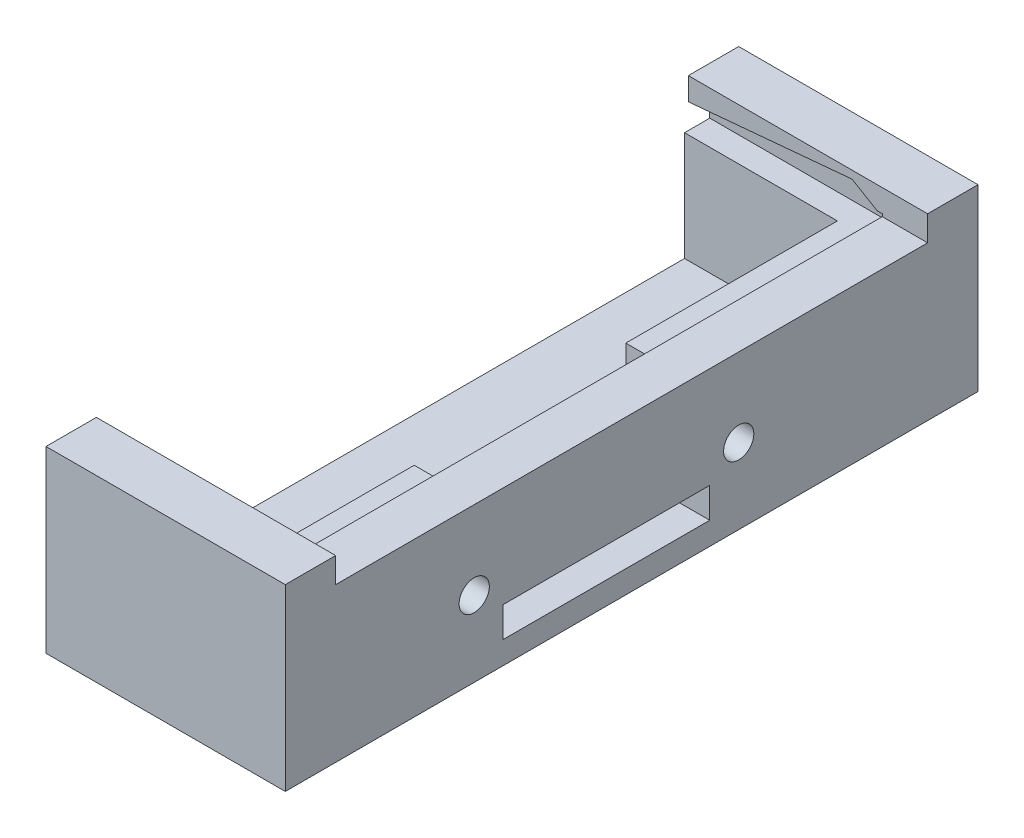
ISO-10303-21;
HEADER;
FILE_DESCRIPTION(('STEP AP214'),'2;1');
FILE_NAME('part.step','',(''),(''),'','','');
FILE_SCHEMA(('AUTOMOTIVE_DESIGN { 1 0 10303 214 1 1 1 1 }'));
ENDSEC;
DATA;
#1=APPLICATION_CONTEXT('core data for automotive mechanical design processes');
#2=APPLICATION_PROTOCOL_DEFINITION('international standard','automotive_design',2000,#1);
#3=PRODUCT_CONTEXT('',#1,'mechanical');
#4=PRODUCT('Part','Part','',(#3));
#5=PRODUCT_RELATED_PRODUCT_CATEGORY('part','',(#4));
#6=PRODUCT_DEFINITION_FORMATION('','',#4);
#7=PRODUCT_DEFINITION_CONTEXT('part definition',#1,'design');
#8=PRODUCT_DEFINITION('design','',#6,#7);
#9=PRODUCT_DEFINITION_SHAPE('','',#8);
#10=(LENGTH_UNIT() NAMED_UNIT(*) SI_UNIT(.MILLI.,.METRE.));
#11=(NAMED_UNIT(*) PLANE_ANGLE_UNIT() SI_UNIT($,.RADIAN.));
#12=(NAMED_UNIT(*) SI_UNIT($,.STERADIAN.) SOLID_ANGLE_UNIT());
#13=UNCERTAINTY_MEASURE_WITH_UNIT(LENGTH_MEASURE(1.E-05),#10,'distance_accuracy_value','');
#14=(GEOMETRIC_REPRESENTATION_CONTEXT(3) GLOBAL_UNCERTAINTY_ASSIGNED_CONTEXT((#13)) GLOBAL_UNIT_ASSIGNED_CONTEXT((#10,
#11,#12)) REPRESENTATION_CONTEXT('',''));
#15=CARTESIAN_POINT('',(0.,0.,0.));
#16=DIRECTION('',(0.,0.,1.));
#17=DIRECTION('',(1.,0.,0.));
#18=AXIS2_PLACEMENT_3D('',#15,#16,#17);
#19=CARTESIAN_POINT('',(5.08,4.54,3.175));
#20=DIRECTION('',(0.,-1.,0.));
#21=DIRECTION('',(0.,0.,-1.));
#22=AXIS2_PLACEMENT_3D('',#19,#20,#21);
#23=PLANE('',#22);
#24=DIRECTION('',(0.,0.,1.));
#25=VECTOR('',#24,1.);
#26=CARTESIAN_POINT('',(5.08,4.54,3.175));
#27=LINE('',#26,#25);
#28=CARTESIAN_POINT('',(5.08000000000001,4.54,-1.905));
#29=VERTEX_POINT('',#28);
#30=CARTESIAN_POINT('',(5.08,4.54,3.175));
#31=VERTEX_POINT('',#30);
#32=EDGE_CURVE('E440',#29,#31,#27,.T.);
#33=ORIENTED_EDGE('',*,*,#32,.F.);
#34=DIRECTION('',(1.,0.,0.));
#35=VECTOR('',#34,1.);
#36=CARTESIAN_POINT('',(5.08000000000001,4.54,-1.905));
#37=LINE('',#36,#35);
#38=CARTESIAN_POINT('',(-19.05,4.54,-1.905));
#39=VERTEX_POINT('',#38);
#40=EDGE_CURVE('E360',#39,#29,#37,.T.);
#41=ORIENTED_EDGE('',*,*,#40,.F.);
#42=DIRECTION('',(0.,0.,1.));
#43=VECTOR('',#42,1.);
#44=CARTESIAN_POINT('',(-19.05,4.54,3.175));
#45=LINE('',#44,#43);
#46=CARTESIAN_POINT('',(-19.05,4.54,3.175));
#47=VERTEX_POINT('',#46);
#48=EDGE_CURVE('E429',#39,#47,#45,.T.);
#49=ORIENTED_EDGE('',*,*,#48,.T.);
#50=DIRECTION('',(-1.,0.,0.));
#51=VECTOR('',#50,1.);
#52=CARTESIAN_POINT('',(5.08,4.54,3.175));
#53=LINE('',#52,#51);
#54=EDGE_CURVE('E444',#31,#47,#53,.T.);
#55=ORIENTED_EDGE('',*,*,#54,.F.);
#56=EDGE_LOOP('',(#33,#41,#49,#55));
#57=FACE_BOUND('',#56,.T.);
#58=ADVANCED_FACE('F40',(#57),#23,.F.);
#59=CARTESIAN_POINT('',(0.,2.254,0.));
#60=DIRECTION('',(0.,1.,0.));
#61=DIRECTION('',(0.,0.,1.));
#62=AXIS2_PLACEMENT_3D('',#59,#60,#61);
#63=PLANE('',#62);
#64=DIRECTION('',(1.,0.,0.));
#65=VECTOR('',#64,1.);
#66=CARTESIAN_POINT('',(0.508,2.254,0.254000000000016));
#67=LINE('',#66,#65);
#68=CARTESIAN_POINT('',(0.,2.254,0.254000000000015));
#69=VERTEX_POINT('',#68);
#70=CARTESIAN_POINT('',(0.508,2.254,0.254000000000016));
#71=VERTEX_POINT('',#70);
#72=EDGE_CURVE('E413',#69,#71,#67,.T.);
#73=ORIENTED_EDGE('',*,*,#72,.F.);
#74=DIRECTION('',(0.,0.,-1.));
#75=VECTOR('',#74,1.);
#76=CARTESIAN_POINT('',(0.,2.254,19.3629638651602));
#77=LINE('',#76,#75);
#78=CARTESIAN_POINT('',(0.,2.254,-1.905));
#79=VERTEX_POINT('',#78);
#80=EDGE_CURVE('E249',#69,#79,#77,.T.);
#81=ORIENTED_EDGE('',*,*,#80,.T.);
#82=DIRECTION('',(1.,0.,0.));
#83=VECTOR('',#82,1.);
#84=CARTESIAN_POINT('',(0.,2.254,-1.905));
#85=LINE('',#84,#83);
#86=CARTESIAN_POINT('',(0.508,2.254,-1.905));
#87=VERTEX_POINT('',#86);
#88=EDGE_CURVE('E262',#79,#87,#85,.T.);
#89=ORIENTED_EDGE('',*,*,#88,.T.);
#90=DIRECTION('',(0.,0.,-1.));
#91=VECTOR('',#90,1.);
#92=CARTESIAN_POINT('',(0.508,2.254,0.254000000000016));
#93=LINE('',#92,#91);
#94=EDGE_CURVE('E407',#71,#87,#93,.T.);
#95=ORIENTED_EDGE('',*,*,#94,.F.);
#96=EDGE_LOOP('',(#73,#81,#89,#95));
#97=FACE_BOUND('',#96,.T.);
#98=ADVANCED_FACE('F497',(#97),#63,.F.);
#99=CARTESIAN_POINT('',(5.08,-13.5255,3.175));
#100=DIRECTION('',(0.,0.,-1.));
#101=DIRECTION('',(-1.,0.,0.));
#102=AXIS2_PLACEMENT_3D('',#99,#100,#101);
#103=PLANE('',#102);
#104=ORIENTED_EDGE('',*,*,#54,.T.);
#105=DIRECTION('',(0.,-1.,0.));
#106=VECTOR('',#105,1.);
#107=CARTESIAN_POINT('',(-19.05,-13.5255,3.175));
#108=LINE('',#107,#106);
#109=CARTESIAN_POINT('',(-19.05,-13.5255,3.175));
#110=VERTEX_POINT('',#109);
#111=EDGE_CURVE('E420',#47,#110,#108,.T.);
#112=ORIENTED_EDGE('',*,*,#111,.T.);
#113=DIRECTION('',(-1.,0.,0.));
#114=VECTOR('',#113,1.);
#115=CARTESIAN_POINT('',(5.08,-13.5255,3.175));
#116=LINE('',#115,#114);
#117=CARTESIAN_POINT('',(5.08,-13.5255,3.175));
#118=VERTEX_POINT('',#117);
#119=EDGE_CURVE('E451',#118,#110,#116,.T.);
#120=ORIENTED_EDGE('',*,*,#119,.F.);
#121=DIRECTION('',(0.,-1.,0.));
#122=VECTOR('',#121,1.);
#123=CARTESIAN_POINT('',(5.08,-13.5255,3.175));
#124=LINE('',#123,#122);
#125=EDGE_CURVE('E433',#31,#118,#124,.T.);
#126=ORIENTED_EDGE('',*,*,#125,.F.);
#127=EDGE_LOOP('',(#104,#112,#120,#126));
#128=FACE_BOUND('',#127,.T.);
#129=ADVANCED_FACE('F42',(#128),#103,.F.);
#130=CARTESIAN_POINT('',(5.08,-13.5255,3.175));
#131=DIRECTION('',(0.,1.,0.));
#132=DIRECTION('',(0.,0.,1.));
#133=AXIS2_PLACEMENT_3D('',#130,#131,#132);
#134=PLANE('',#133);
#135=ORIENTED_EDGE('',*,*,#119,.T.);
#136=DIRECTION('',(0.,0.,-1.));
#137=VECTOR('',#136,1.);
#138=CARTESIAN_POINT('',(-19.05,-13.5255,3.175));
#139=LINE('',#138,#137);
#140=CARTESIAN_POINT('',(-19.05,-13.5255,-66.675));
#141=VERTEX_POINT('',#140);
#142=EDGE_CURVE('E423',#110,#141,#139,.T.);
#143=ORIENTED_EDGE('',*,*,#142,.T.);
#144=DIRECTION('',(-1.,0.,0.));
#145=VECTOR('',#144,1.);
#146=CARTESIAN_POINT('',(5.08,-13.5255,-66.675));
#147=LINE('',#146,#145);
#148=CARTESIAN_POINT('',(5.08,-13.5255,-66.675));
#149=VERTEX_POINT('',#148);
#150=EDGE_CURVE('E449',#149,#141,#147,.T.);
#151=ORIENTED_EDGE('',*,*,#150,.F.);
#152=DIRECTION('',(0.,0.,-1.));
#153=VECTOR('',#152,1.);
#154=CARTESIAN_POINT('',(5.08,-13.5255,3.175));
#155=LINE('',#154,#153);
#156=EDGE_CURVE('E436',#118,#149,#155,.T.);
#157=ORIENTED_EDGE('',*,*,#156,.F.);
#158=EDGE_LOOP('',(#135,#143,#151,#157));
#159=FACE_BOUND('',#158,.T.);
#160=ADVANCED_FACE('F520',(#159),#134,.F.);
#161=CARTESIAN_POINT('',(5.08,-13.5255,-66.675));
#162=DIRECTION('',(0.,0.,1.));
#163=DIRECTION('',(1.,0.,0.));
#164=AXIS2_PLACEMENT_3D('',#161,#162,#163);
#165=PLANE('',#164);
#166=ORIENTED_EDGE('',*,*,#150,.T.);
#167=DIRECTION('',(0.,1.,0.));
#168=VECTOR('',#167,1.);
#169=CARTESIAN_POINT('',(-19.05,-13.5255,-66.675));
#170=LINE('',#169,#168);
#171=CARTESIAN_POINT('',(-19.05,4.54,-66.675));
#172=VERTEX_POINT('',#171);
#173=EDGE_CURVE('E426',#141,#172,#170,.T.);
#174=ORIENTED_EDGE('',*,*,#173,.T.);
#175=DIRECTION('',(-1.,0.,0.));
#176=VECTOR('',#175,1.);
#177=CARTESIAN_POINT('',(5.08,4.54,-66.675));
#178=LINE('',#177,#176);
#179=CARTESIAN_POINT('',(5.08,4.54,-66.675));
#180=VERTEX_POINT('',#179);
#181=EDGE_CURVE('E447',#180,#172,#178,.T.);
#182=ORIENTED_EDGE('',*,*,#181,.F.);
#183=DIRECTION('',(0.,1.,0.));
#184=VECTOR('',#183,1.);
#185=CARTESIAN_POINT('',(5.08,-13.5255,-66.675));
#186=LINE('',#185,#184);
#187=EDGE_CURVE('E438',#149,#180,#186,.T.);
#188=ORIENTED_EDGE('',*,*,#187,.F.);
#189=EDGE_LOOP('',(#166,#174,#182,#188));
#190=FACE_BOUND('',#189,.T.);
#191=ADVANCED_FACE('F512',(#190),#165,.F.);
#192=CARTESIAN_POINT('',(-19.05,4.54,-61.595));
#193=VERTEX_POINT('',#192);
#194=EDGE_CURVE('E430',#172,#193,#45,.T.);
#195=ORIENTED_EDGE('',*,*,#194,.T.);
#196=DIRECTION('',(-1.,0.,0.));
#197=VECTOR('',#196,1.);
#198=CARTESIAN_POINT('',(5.08,4.54,-61.595));
#199=LINE('',#198,#197);
#200=CARTESIAN_POINT('',(5.08,4.54,-61.595));
#201=VERTEX_POINT('',#200);
#202=EDGE_CURVE('E350',#201,#193,#199,.T.);
#203=ORIENTED_EDGE('',*,*,#202,.F.);
#204=EDGE_CURVE('E441',#180,#201,#27,.T.);
#205=ORIENTED_EDGE('',*,*,#204,.F.);
#206=ORIENTED_EDGE('',*,*,#181,.T.);
#207=EDGE_LOOP('',(#195,#203,#205,#206));
#208=FACE_BOUND('',#207,.T.);
#209=ADVANCED_FACE('F500',(#208),#23,.F.);
#210=CARTESIAN_POINT('',(5.08,0.,0.));
#211=DIRECTION('',(-1.,0.,0.));
#212=DIRECTION('',(0.,0.,1.));
#213=AXIS2_PLACEMENT_3D('',#210,#211,#212);
#214=PLANE('',#213);
#215=CARTESIAN_POINT('',(5.08,-5.9055,-15.875));
#216=DIRECTION('',(1.,0.,0.));
#217=DIRECTION('',(0.,0.,-1.));
#218=AXIS2_PLACEMENT_3D('',#215,#216,#217);
#219=CIRCLE('',#218,1.524);
#220=CARTESIAN_POINT('',(5.08,-5.9055,-17.399));
#221=VERTEX_POINT('',#220);
#222=EDGE_CURVE('E283',#221,#221,#219,.T.);
#223=ORIENTED_EDGE('',*,*,#222,.F.);
#224=EDGE_LOOP('',(#223));
#225=FACE_BOUND('',#224,.T.);
#226=CARTESIAN_POINT('',(5.08,-5.9055,-42.545));
#227=DIRECTION('',(1.,0.,0.));
#228=DIRECTION('',(0.,0.,-1.));
#229=AXIS2_PLACEMENT_3D('',#226,#227,#228);
#230=CIRCLE('',#229,1.524);
#231=CARTESIAN_POINT('',(5.08,-5.9055,-44.069));
#232=VERTEX_POINT('',#231);
#233=EDGE_CURVE('E281',#232,#232,#230,.T.);
#234=ORIENTED_EDGE('',*,*,#233,.F.);
#235=EDGE_LOOP('',(#234));
#236=FACE_BOUND('',#235,.T.);
#237=DIRECTION('',(0.,0.,1.));
#238=VECTOR('',#237,1.);
#239=CARTESIAN_POINT('',(5.08,-11.2395,0.));
#240=LINE('',#239,#238);
#241=CARTESIAN_POINT('',(5.08,-11.2395,-39.624));
#242=VERTEX_POINT('',#241);
#243=CARTESIAN_POINT('',(5.08,-11.2395,-18.796));
#244=VERTEX_POINT('',#243);
#245=EDGE_CURVE('E381',#242,#244,#240,.T.);
#246=ORIENTED_EDGE('',*,*,#245,.T.);
#247=DIRECTION('',(0.,1.,0.));
#248=VECTOR('',#247,1.);
#249=CARTESIAN_POINT('',(5.08,0.,-18.796));
#250=LINE('',#249,#248);
#251=CARTESIAN_POINT('',(5.08,-8.1915,-18.796));
#252=VERTEX_POINT('',#251);
#253=EDGE_CURVE('E395',#244,#252,#250,.T.);
#254=ORIENTED_EDGE('',*,*,#253,.T.);
#255=DIRECTION('',(0.,0.,-1.));
#256=VECTOR('',#255,1.);
#257=CARTESIAN_POINT('',(5.08,-8.1915,0.));
#258=LINE('',#257,#256);
#259=CARTESIAN_POINT('',(5.08,-8.1915,-39.624));
#260=VERTEX_POINT('',#259);
#261=EDGE_CURVE('E392',#252,#260,#258,.T.);
#262=ORIENTED_EDGE('',*,*,#261,.T.);
#263=DIRECTION('',(0.,-1.,0.));
#264=VECTOR('',#263,1.);
#265=CARTESIAN_POINT('',(5.08,0.,-39.624));
#266=LINE('',#265,#264);
#267=EDGE_CURVE('E389',#260,#242,#266,.T.);
#268=ORIENTED_EDGE('',*,*,#267,.T.);
#269=EDGE_LOOP('',(#246,#254,#262,#268));
#270=FACE_BOUND('',#269,.T.);
#271=DIRECTION('',(0.,0.,1.));
#272=VECTOR('',#271,1.);
#273=CARTESIAN_POINT('',(5.08,2.,-61.595));
#274=LINE('',#273,#272);
#275=CARTESIAN_POINT('',(5.08,2.,-61.595));
#276=VERTEX_POINT('',#275);
#277=CARTESIAN_POINT('',(5.08000000000001,2.,-1.905));
#278=VERTEX_POINT('',#277);
#279=EDGE_CURVE('E354',#276,#278,#274,.T.);
#280=ORIENTED_EDGE('',*,*,#279,.T.);
#281=DIRECTION('',(0.,1.,0.));
#282=VECTOR('',#281,1.);
#283=CARTESIAN_POINT('',(5.08000000000001,-62.3828626266338,-1.905));
#284=LINE('',#283,#282);
#285=EDGE_CURVE('E355',#278,#29,#284,.T.);
#286=ORIENTED_EDGE('',*,*,#285,.T.);
#287=ORIENTED_EDGE('',*,*,#32,.T.);
#288=ORIENTED_EDGE('',*,*,#125,.T.);
#289=ORIENTED_EDGE('',*,*,#156,.T.);
#290=ORIENTED_EDGE('',*,*,#187,.T.);
#291=ORIENTED_EDGE('',*,*,#204,.T.);
#292=DIRECTION('',(0.,1.,0.));
#293=VECTOR('',#292,1.);
#294=CARTESIAN_POINT('',(5.08,-62.3828626266338,-61.595));
#295=LINE('',#294,#293);
#296=EDGE_CURVE('E362',#276,#201,#295,.T.);
#297=ORIENTED_EDGE('',*,*,#296,.F.);
#298=EDGE_LOOP('',(#280,#286,#287,#288,#289,#290,#291,#297));
#299=FACE_BOUND('',#298,.T.);
#300=ADVANCED_FACE('F511',(#225,#236,#270,#299),#214,.F.);
#301=CARTESIAN_POINT('',(-19.05,0.,0.));
#302=DIRECTION('',(-1.,0.,0.));
#303=DIRECTION('',(0.,0.,1.));
#304=AXIS2_PLACEMENT_3D('',#301,#302,#303);
#305=PLANE('',#304);
#306=DIRECTION('',(0.,1.,0.));
#307=VECTOR('',#306,1.);
#308=CARTESIAN_POINT('',(-19.05,-0.254,-2.28599999999998));
#309=LINE('',#308,#307);
#310=CARTESIAN_POINT('',(-19.05,-11.2395,-2.28599999999998));
#311=VERTEX_POINT('',#310);
#312=CARTESIAN_POINT('',(-19.05,-0.254,-2.28599999999998));
#313=VERTEX_POINT('',#312);
#314=EDGE_CURVE('E289',#311,#313,#309,.T.);
#315=ORIENTED_EDGE('',*,*,#314,.F.);
#316=DIRECTION('',(0.,0.,-1.));
#317=VECTOR('',#316,1.);
#318=CARTESIAN_POINT('',(-19.05,-11.2395,-18.796));
#319=LINE('',#318,#317);
#320=CARTESIAN_POINT('',(-19.05,-11.2395,-61.214));
#321=VERTEX_POINT('',#320);
#322=EDGE_CURVE('E376',#311,#321,#319,.T.);
#323=ORIENTED_EDGE('',*,*,#322,.T.);
#324=DIRECTION('',(0.,-1.,0.));
#325=VECTOR('',#324,1.);
#326=CARTESIAN_POINT('',(-19.05,-0.254,-61.214));
#327=LINE('',#326,#325);
#328=CARTESIAN_POINT('',(-19.05,-0.254,-61.214));
#329=VERTEX_POINT('',#328);
#330=EDGE_CURVE('E291',#329,#321,#327,.T.);
#331=ORIENTED_EDGE('',*,*,#330,.F.);
#332=DIRECTION('',(0.,0.,-1.));
#333=VECTOR('',#332,1.);
#334=CARTESIAN_POINT('',(-19.05,-0.254,0.));
#335=LINE('',#334,#333);
#336=CARTESIAN_POINT('',(-19.05,-0.254,-63.754));
#337=VERTEX_POINT('',#336);
#338=EDGE_CURVE('E453',#329,#337,#335,.T.);
#339=ORIENTED_EDGE('',*,*,#338,.T.);
#340=DIRECTION('',(0.,1.,0.));
#341=VECTOR('',#340,1.);
#342=CARTESIAN_POINT('',(-19.05,0.,-63.754));
#343=LINE('',#342,#341);
#344=CARTESIAN_POINT('',(-19.05,2.254,-63.754));
#345=VERTEX_POINT('',#344);
#346=EDGE_CURVE('E460',#337,#345,#343,.T.);
#347=ORIENTED_EDGE('',*,*,#346,.T.);
#348=DIRECTION('',(0.,0.,-1.));
#349=VECTOR('',#348,1.);
#350=CARTESIAN_POINT('',(-19.05,2.254,0.));
#351=LINE('',#350,#349);
#352=CARTESIAN_POINT('',(-19.05,2.254,-61.595));
#353=VERTEX_POINT('',#352);
#354=EDGE_CURVE('E463',#353,#345,#351,.T.);
#355=ORIENTED_EDGE('',*,*,#354,.F.);
#356=DIRECTION('',(0.,1.,0.));
#357=VECTOR('',#356,1.);
#358=CARTESIAN_POINT('',(-19.05,-62.3828626266338,-61.595));
#359=LINE('',#358,#357);
#360=EDGE_CURVE('E367',#353,#193,#359,.T.);
#361=ORIENTED_EDGE('',*,*,#360,.T.);
#362=ORIENTED_EDGE('',*,*,#194,.F.);
#363=ORIENTED_EDGE('',*,*,#173,.F.);
#364=ORIENTED_EDGE('',*,*,#142,.F.);
#365=ORIENTED_EDGE('',*,*,#111,.F.);
#366=ORIENTED_EDGE('',*,*,#48,.F.);
#367=DIRECTION('',(0.,1.,0.));
#368=VECTOR('',#367,1.);
#369=CARTESIAN_POINT('',(-19.05,-62.3828626266338,-1.905));
#370=LINE('',#369,#368);
#371=CARTESIAN_POINT('',(-19.05,2.25400000000001,-1.905));
#372=VERTEX_POINT('',#371);
#373=EDGE_CURVE('E365',#372,#39,#370,.T.);
#374=ORIENTED_EDGE('',*,*,#373,.F.);
#375=CARTESIAN_POINT('',(-19.05,2.254,0.254000000000017));
#376=VERTEX_POINT('',#375);
#377=EDGE_CURVE('E255',#376,#372,#351,.T.);
#378=ORIENTED_EDGE('',*,*,#377,.F.);
#379=DIRECTION('',(0.,-1.,0.));
#380=VECTOR('',#379,1.);
#381=CARTESIAN_POINT('',(-19.05,0.,0.254000000000018));
#382=LINE('',#381,#380);
#383=CARTESIAN_POINT('',(-19.05,-0.254000000000004,0.254000000000018));
#384=VERTEX_POINT('',#383);
#385=EDGE_CURVE('E457',#376,#384,#382,.T.);
#386=ORIENTED_EDGE('',*,*,#385,.T.);
#387=EDGE_CURVE('E454',#384,#313,#335,.T.);
#388=ORIENTED_EDGE('',*,*,#387,.T.);
#389=EDGE_LOOP('',(#315,#323,#331,#339,#347,#355,#361,#362,#363,#364,#365,#366,#374,#378,#386,#388));
#390=FACE_BOUND('',#389,.T.);
#391=ADVANCED_FACE('F518',(#390),#305,.T.);
#392=CARTESIAN_POINT('',(0.508,2.254,0.254000000000016));
#393=DIRECTION('',(-1.,0.,0.));
#394=DIRECTION('',(0.,0.,1.));
#395=AXIS2_PLACEMENT_3D('',#392,#393,#394);
#396=PLANE('',#395);
#397=DIRECTION('',(0.,1.,0.));
#398=VECTOR('',#397,1.);
#399=CARTESIAN_POINT('',(0.508,2.254,-1.905));
#400=LINE('',#399,#398);
#401=CARTESIAN_POINT('',(0.508,2.,-1.905));
#402=VERTEX_POINT('',#401);
#403=EDGE_CURVE('E374',#402,#87,#400,.T.);
#404=ORIENTED_EDGE('',*,*,#403,.F.);
#405=DIRECTION('',(0.,0.,-1.));
#406=VECTOR('',#405,1.);
#407=CARTESIAN_POINT('',(0.508,2.,0.254000000000016));
#408=LINE('',#407,#406);
#409=CARTESIAN_POINT('',(0.508,2.,-61.595));
#410=VERTEX_POINT('',#409);
#411=EDGE_CURVE('E49',#402,#410,#408,.T.);
#412=ORIENTED_EDGE('',*,*,#411,.T.);
#413=DIRECTION('',(0.,-1.,0.));
#414=VECTOR('',#413,1.);
#415=CARTESIAN_POINT('',(0.508,2.254,-61.595));
#416=LINE('',#415,#414);
#417=CARTESIAN_POINT('',(0.508,2.254,-61.595));
#418=VERTEX_POINT('',#417);
#419=EDGE_CURVE('E372',#418,#410,#416,.T.);
#420=ORIENTED_EDGE('',*,*,#419,.F.);
#421=CARTESIAN_POINT('',(0.508,2.254,-63.754));
#422=VERTEX_POINT('',#421);
#423=EDGE_CURVE('E406',#418,#422,#93,.T.);
#424=ORIENTED_EDGE('',*,*,#423,.T.);
#425=DIRECTION('',(0.,-1.,0.));
#426=VECTOR('',#425,1.);
#427=CARTESIAN_POINT('',(0.508,2.254,-63.754));
#428=LINE('',#427,#426);
#429=CARTESIAN_POINT('',(0.508,-0.254000000000004,-63.754));
#430=VERTEX_POINT('',#429);
#431=EDGE_CURVE('E417',#422,#430,#428,.T.);
#432=ORIENTED_EDGE('',*,*,#431,.T.);
#433=DIRECTION('',(0.,0.,1.));
#434=VECTOR('',#433,1.);
#435=CARTESIAN_POINT('',(0.508,-0.254000000000004,0.254000000000016));
#436=LINE('',#435,#434);
#437=CARTESIAN_POINT('',(0.508,-0.254000000000004,0.254000000000016));
#438=VERTEX_POINT('',#437);
#439=EDGE_CURVE('E401',#430,#438,#436,.T.);
#440=ORIENTED_EDGE('',*,*,#439,.T.);
#441=DIRECTION('',(0.,-1.,0.));
#442=VECTOR('',#441,1.);
#443=CARTESIAN_POINT('',(0.508,2.254,0.254000000000016));
#444=LINE('',#443,#442);
#445=EDGE_CURVE('E415',#71,#438,#444,.T.);
#446=ORIENTED_EDGE('',*,*,#445,.F.);
#447=ORIENTED_EDGE('',*,*,#94,.T.);
#448=EDGE_LOOP('',(#404,#412,#420,#424,#432,#440,#446,#447));
#449=FACE_BOUND('',#448,.T.);
#450=ADVANCED_FACE('F553',(#449),#396,.T.);
#451=CARTESIAN_POINT('',(0.508,2.254,-63.754));
#452=DIRECTION('',(0.,0.,1.));
#453=DIRECTION('',(1.,0.,0.));
#454=AXIS2_PLACEMENT_3D('',#451,#452,#453);
#455=PLANE('',#454);
#456=DIRECTION('',(1.,0.,0.));
#457=VECTOR('',#456,1.);
#458=CARTESIAN_POINT('',(0.508,-0.254000000000004,-63.754));
#459=LINE('',#458,#457);
#460=EDGE_CURVE('E404',#337,#430,#459,.T.);
#461=ORIENTED_EDGE('',*,*,#460,.T.);
#462=ORIENTED_EDGE('',*,*,#431,.F.);
#463=DIRECTION('',(-1.,0.,0.));
#464=VECTOR('',#463,1.);
#465=CARTESIAN_POINT('',(0.508,2.254,-63.754));
#466=LINE('',#465,#464);
#467=CARTESIAN_POINT('',(0.,2.254,-63.754));
#468=VERTEX_POINT('',#467);
#469=EDGE_CURVE('E410',#422,#468,#466,.T.);
#470=ORIENTED_EDGE('',*,*,#469,.T.);
#471=DIRECTION('',(-0.861061475171783,0.508500871164439,0.));
#472=VECTOR('',#471,1.);
#473=CARTESIAN_POINT('',(-2.54,3.754,-63.754));
#474=LINE('',#473,#472);
#475=CARTESIAN_POINT('',(-2.54,3.754,-63.754));
#476=VERTEX_POINT('',#475);
#477=EDGE_CURVE('E270',#468,#476,#474,.T.);
#478=ORIENTED_EDGE('',*,*,#477,.T.);
#479=DIRECTION('',(-0.995898149319108,-0.0904813582058547,0.));
#480=VECTOR('',#479,1.);
#481=CARTESIAN_POINT('',(-19.05,2.254,-63.754));
#482=LINE('',#481,#480);
#483=EDGE_CURVE('E273',#476,#345,#482,.T.);
#484=ORIENTED_EDGE('',*,*,#483,.T.);
#485=ORIENTED_EDGE('',*,*,#346,.F.);
#486=EDGE_LOOP('',(#461,#462,#470,#478,#484,#485));
#487=FACE_BOUND('',#486,.T.);
#488=ADVANCED_FACE('F612',(#487),#455,.T.);
#489=CARTESIAN_POINT('',(0.508,2.254,0.254000000000016));
#490=DIRECTION('',(0.,0.,-1.));
#491=DIRECTION('',(-1.,0.,0.));
#492=AXIS2_PLACEMENT_3D('',#489,#490,#491);
#493=PLANE('',#492);
#494=ORIENTED_EDGE('',*,*,#385,.F.);
#495=DIRECTION('',(-0.995898149319108,-0.0904813582058548,0.));
#496=VECTOR('',#495,1.);
#497=CARTESIAN_POINT('',(-0.941991051739184,3.89918554950885,0.254000000000015));
#498=LINE('',#497,#496);
#499=CARTESIAN_POINT('',(-2.54000000000001,3.75399999999999,0.254000000000022));
#500=VERTEX_POINT('',#499);
#501=EDGE_CURVE('E267',#500,#376,#498,.T.);
#502=ORIENTED_EDGE('',*,*,#501,.F.);
#503=DIRECTION('',(-0.861061475171783,0.508500871164439,0.));
#504=VECTOR('',#503,1.);
#505=CARTESIAN_POINT('',(32.0677317513417,-16.6836368610286,0.254000000000011));
#506=LINE('',#505,#504);
#507=EDGE_CURVE('E246',#69,#500,#506,.T.);
#508=ORIENTED_EDGE('',*,*,#507,.F.);
#509=ORIENTED_EDGE('',*,*,#72,.T.);
#510=ORIENTED_EDGE('',*,*,#445,.T.);
#511=DIRECTION('',(-1.,0.,0.));
#512=VECTOR('',#511,1.);
#513=CARTESIAN_POINT('',(0.508,-0.254000000000004,0.254000000000016));
#514=LINE('',#513,#512);
#515=EDGE_CURVE('E398',#438,#384,#514,.T.);
#516=ORIENTED_EDGE('',*,*,#515,.T.);
#517=EDGE_LOOP('',(#494,#502,#508,#509,#510,#516));
#518=FACE_BOUND('',#517,.T.);
#519=ADVANCED_FACE('F560',(#518),#493,.T.);
#520=DIRECTION('',(-1.,0.,0.));
#521=VECTOR('',#520,1.);
#522=CARTESIAN_POINT('',(0.,2.254,-61.595));
#523=LINE('',#522,#521);
#524=CARTESIAN_POINT('',(0.,2.254,-61.595));
#525=VERTEX_POINT('',#524);
#526=EDGE_CURVE('E465',#418,#525,#523,.T.);
#527=ORIENTED_EDGE('',*,*,#526,.T.);
#528=DIRECTION('',(0.,0.,1.));
#529=VECTOR('',#528,1.);
#530=CARTESIAN_POINT('',(0.,2.254,-63.754));
#531=LINE('',#530,#529);
#532=EDGE_CURVE('E57',#468,#525,#531,.T.);
#533=ORIENTED_EDGE('',*,*,#532,.F.);
#534=ORIENTED_EDGE('',*,*,#469,.F.);
#535=ORIENTED_EDGE('',*,*,#423,.F.);
#536=EDGE_LOOP('',(#527,#533,#534,#535));
#537=FACE_BOUND('',#536,.T.);
#538=ADVANCED_FACE('F506',(#537),#63,.F.);
#539=CARTESIAN_POINT('',(0.,-0.254,0.));
#540=DIRECTION('',(0.,1.,0.));
#541=DIRECTION('',(0.,0.,1.));
#542=AXIS2_PLACEMENT_3D('',#539,#540,#541);
#543=PLANE('',#542);
#544=DIRECTION('',(0.,0.,-1.));
#545=VECTOR('',#544,1.);
#546=CARTESIAN_POINT('',(-3.63837819090691,-0.254,-61.214));
#547=LINE('',#546,#545);
#548=CARTESIAN_POINT('',(-3.63837819090691,-0.254,-2.28599999999998));
#549=VERTEX_POINT('',#548);
#550=CARTESIAN_POINT('',(-3.63837819090691,-0.254,-18.542));
#551=VERTEX_POINT('',#550);
#552=EDGE_CURVE('E302',#549,#551,#547,.T.);
#553=ORIENTED_EDGE('',*,*,#552,.F.);
#554=DIRECTION('',(-1.,0.,0.));
#555=VECTOR('',#554,1.);
#556=CARTESIAN_POINT('',(59.3528482341864,-0.254,-2.28599999999998));
#557=LINE('',#556,#555);
#558=EDGE_CURVE('E308',#549,#313,#557,.T.);
#559=ORIENTED_EDGE('',*,*,#558,.T.);
#560=ORIENTED_EDGE('',*,*,#387,.F.);
#561=ORIENTED_EDGE('',*,*,#515,.F.);
#562=ORIENTED_EDGE('',*,*,#439,.F.);
#563=ORIENTED_EDGE('',*,*,#460,.F.);
#564=ORIENTED_EDGE('',*,*,#338,.F.);
#565=DIRECTION('',(-1.,0.,0.));
#566=VECTOR('',#565,1.);
#567=CARTESIAN_POINT('',(59.3528482341864,-0.254,-61.214));
#568=LINE('',#567,#566);
#569=CARTESIAN_POINT('',(-3.63837819090691,-0.254,-61.214));
#570=VERTEX_POINT('',#569);
#571=EDGE_CURVE('E301',#570,#329,#568,.T.);
#572=ORIENTED_EDGE('',*,*,#571,.F.);
#573=CARTESIAN_POINT('',(-3.63837819090691,-0.254,-39.878));
#574=VERTEX_POINT('',#573);
#575=EDGE_CURVE('E304',#574,#570,#547,.T.);
#576=ORIENTED_EDGE('',*,*,#575,.F.);
#577=DIRECTION('',(-1.,0.,0.));
#578=VECTOR('',#577,1.);
#579=CARTESIAN_POINT('',(-0.590378190906907,-0.254,-39.878));
#580=LINE('',#579,#578);
#581=CARTESIAN_POINT('',(-0.590378190906907,-0.254,-39.878));
#582=VERTEX_POINT('',#581);
#583=EDGE_CURVE('E323',#582,#574,#580,.T.);
#584=ORIENTED_EDGE('',*,*,#583,.F.);
#585=DIRECTION('',(0.,0.,-1.));
#586=VECTOR('',#585,1.);
#587=CARTESIAN_POINT('',(-0.590378190906907,-0.254,-39.878));
#588=LINE('',#587,#586);
#589=CARTESIAN_POINT('',(-0.590378190906904,-0.254,-18.542));
#590=VERTEX_POINT('',#589);
#591=EDGE_CURVE('E319',#590,#582,#588,.T.);
#592=ORIENTED_EDGE('',*,*,#591,.F.);
#593=DIRECTION('',(1.,0.,0.));
#594=VECTOR('',#593,1.);
#595=CARTESIAN_POINT('',(-0.590378190906904,-0.254,-18.542));
#596=LINE('',#595,#594);
#597=EDGE_CURVE('E320',#551,#590,#596,.T.);
#598=ORIENTED_EDGE('',*,*,#597,.F.);
#599=EDGE_LOOP('',(#553,#559,#560,#561,#562,#563,#564,#572,#576,#584,#592,#598));
#600=FACE_BOUND('',#599,.T.);
#601=ADVANCED_FACE('F564',(#600),#543,.T.);
#602=CARTESIAN_POINT('',(-19.05,-8.1915,-18.796));
#603=DIRECTION('',(0.,0.,1.));
#604=DIRECTION('',(1.,0.,0.));
#605=AXIS2_PLACEMENT_3D('',#602,#603,#604);
#606=PLANE('',#605);
#607=DIRECTION('',(1.,0.,0.));
#608=VECTOR('',#607,1.);
#609=CARTESIAN_POINT('',(-19.05,-11.2395,-18.796));
#610=LINE('',#609,#608);
#611=CARTESIAN_POINT('',(-0.590378190906904,-11.2395,-18.796));
#612=VERTEX_POINT('',#611);
#613=EDGE_CURVE('E378',#612,#244,#610,.T.);
#614=ORIENTED_EDGE('',*,*,#613,.F.);
#615=DIRECTION('',(0.,1.,0.));
#616=VECTOR('',#615,1.);
#617=CARTESIAN_POINT('',(-0.590378190906904,-8.1915,-18.796));
#618=LINE('',#617,#616);
#619=CARTESIAN_POINT('',(-0.590378190906904,-8.1915,-18.796));
#620=VERTEX_POINT('',#619);
#621=EDGE_CURVE('E347',#612,#620,#618,.T.);
#622=ORIENTED_EDGE('',*,*,#621,.T.);
#623=DIRECTION('',(1.,0.,0.));
#624=VECTOR('',#623,1.);
#625=CARTESIAN_POINT('',(-19.05,-8.1915,-18.796));
#626=LINE('',#625,#624);
#627=EDGE_CURVE('E379',#620,#252,#626,.T.);
#628=ORIENTED_EDGE('',*,*,#627,.T.);
#629=ORIENTED_EDGE('',*,*,#253,.F.);
#630=EDGE_LOOP('',(#614,#622,#628,#629));
#631=FACE_BOUND('',#630,.T.);
#632=ADVANCED_FACE('F582',(#631),#606,.F.);
#633=CARTESIAN_POINT('',(-19.05,-8.1915,-18.796));
#634=DIRECTION('',(0.,1.,0.));
#635=DIRECTION('',(0.,0.,1.));
#636=AXIS2_PLACEMENT_3D('',#633,#634,#635);
#637=PLANE('',#636);
#638=ORIENTED_EDGE('',*,*,#627,.F.);
#639=DIRECTION('',(0.,0.,-1.));
#640=VECTOR('',#639,1.);
#641=CARTESIAN_POINT('',(-0.590378190906904,-8.1915,-18.796));
#642=LINE('',#641,#640);
#643=CARTESIAN_POINT('',(-0.590378190906907,-8.1915,-39.624));
#644=VERTEX_POINT('',#643);
#645=EDGE_CURVE('E344',#620,#644,#642,.T.);
#646=ORIENTED_EDGE('',*,*,#645,.T.);
#647=DIRECTION('',(1.,0.,0.));
#648=VECTOR('',#647,1.);
#649=CARTESIAN_POINT('',(-19.05,-8.1915,-39.624));
#650=LINE('',#649,#648);
#651=EDGE_CURVE('E382',#644,#260,#650,.T.);
#652=ORIENTED_EDGE('',*,*,#651,.T.);
#653=ORIENTED_EDGE('',*,*,#261,.F.);
#654=EDGE_LOOP('',(#638,#646,#652,#653));
#655=FACE_BOUND('',#654,.T.);
#656=ADVANCED_FACE('F586',(#655),#637,.F.);
#657=CARTESIAN_POINT('',(-19.05,-8.1915,-39.624));
#658=DIRECTION('',(0.,0.,-1.));
#659=DIRECTION('',(-1.,0.,0.));
#660=AXIS2_PLACEMENT_3D('',#657,#658,#659);
#661=PLANE('',#660);
#662=ORIENTED_EDGE('',*,*,#651,.F.);
#663=DIRECTION('',(0.,-1.,0.));
#664=VECTOR('',#663,1.);
#665=CARTESIAN_POINT('',(-0.590378190906907,-8.1915,-39.624));
#666=LINE('',#665,#664);
#667=CARTESIAN_POINT('',(-0.590378190906904,-11.2395,-39.624));
#668=VERTEX_POINT('',#667);
#669=EDGE_CURVE('E341',#644,#668,#666,.T.);
#670=ORIENTED_EDGE('',*,*,#669,.T.);
#671=DIRECTION('',(1.,0.,0.));
#672=VECTOR('',#671,1.);
#673=CARTESIAN_POINT('',(-19.05,-11.2395,-39.624));
#674=LINE('',#673,#672);
#675=EDGE_CURVE('E384',#668,#242,#674,.T.);
#676=ORIENTED_EDGE('',*,*,#675,.T.);
#677=ORIENTED_EDGE('',*,*,#267,.F.);
#678=EDGE_LOOP('',(#662,#670,#676,#677));
#679=FACE_BOUND('',#678,.T.);
#680=ADVANCED_FACE('F594',(#679),#661,.F.);
#681=CARTESIAN_POINT('',(-19.05,-11.2395,-18.796));
#682=DIRECTION('',(0.,-1.,0.));
#683=DIRECTION('',(0.,0.,-1.));
#684=AXIS2_PLACEMENT_3D('',#681,#682,#683);
#685=PLANE('',#684);
#686=DIRECTION('',(-1.,0.,0.));
#687=VECTOR('',#686,1.);
#688=CARTESIAN_POINT('',(-0.590378190906907,-11.2395,-39.878));
#689=LINE('',#688,#687);
#690=CARTESIAN_POINT('',(-0.590378190906907,-11.2395,-39.878));
#691=VERTEX_POINT('',#690);
#692=CARTESIAN_POINT('',(-3.63837819090691,-11.2395,-39.878));
#693=VERTEX_POINT('',#692);
#694=EDGE_CURVE('E322',#691,#693,#689,.T.);
#695=ORIENTED_EDGE('',*,*,#694,.T.);
#696=DIRECTION('',(0.,0.,1.));
#697=VECTOR('',#696,1.);
#698=CARTESIAN_POINT('',(-3.63837819090691,-11.2395,-61.214));
#699=LINE('',#698,#697);
#700=CARTESIAN_POINT('',(-3.63837819090691,-11.2395,-61.214));
#701=VERTEX_POINT('',#700);
#702=EDGE_CURVE('E294',#701,#693,#699,.T.);
#703=ORIENTED_EDGE('',*,*,#702,.F.);
#704=DIRECTION('',(-1.,0.,0.));
#705=VECTOR('',#704,1.);
#706=CARTESIAN_POINT('',(59.3528482341864,-11.2395,-61.214));
#707=LINE('',#706,#705);
#708=EDGE_CURVE('E300',#701,#321,#707,.T.);
#709=ORIENTED_EDGE('',*,*,#708,.T.);
#710=ORIENTED_EDGE('',*,*,#322,.F.);
#711=DIRECTION('',(-1.,0.,0.));
#712=VECTOR('',#711,1.);
#713=CARTESIAN_POINT('',(59.3528482341864,-11.2395,-2.28599999999998));
#714=LINE('',#713,#712);
#715=CARTESIAN_POINT('',(-3.63837819090691,-11.2395,-2.28599999999998));
#716=VERTEX_POINT('',#715);
#717=EDGE_CURVE('E296',#716,#311,#714,.T.);
#718=ORIENTED_EDGE('',*,*,#717,.F.);
#719=CARTESIAN_POINT('',(-3.63837819090691,-11.2395,-18.542));
#720=VERTEX_POINT('',#719);
#721=EDGE_CURVE('E65',#720,#716,#699,.T.);
#722=ORIENTED_EDGE('',*,*,#721,.F.);
#723=DIRECTION('',(1.,0.,0.));
#724=VECTOR('',#723,1.);
#725=CARTESIAN_POINT('',(-0.590378190906904,-11.2395,-18.542));
#726=LINE('',#725,#724);
#727=CARTESIAN_POINT('',(-0.590378190906904,-11.2395,-18.542));
#728=VERTEX_POINT('',#727);
#729=EDGE_CURVE('E330',#720,#728,#726,.T.);
#730=ORIENTED_EDGE('',*,*,#729,.T.);
#731=DIRECTION('',(0.,0.,-1.));
#732=VECTOR('',#731,1.);
#733=CARTESIAN_POINT('',(-0.590378190906907,-11.2395,-39.878));
#734=LINE('',#733,#732);
#735=EDGE_CURVE('E331',#728,#612,#734,.T.);
#736=ORIENTED_EDGE('',*,*,#735,.T.);
#737=ORIENTED_EDGE('',*,*,#613,.T.);
#738=ORIENTED_EDGE('',*,*,#245,.F.);
#739=ORIENTED_EDGE('',*,*,#675,.F.);
#740=EDGE_CURVE('E335',#668,#691,#734,.T.);
#741=ORIENTED_EDGE('',*,*,#740,.T.);
#742=EDGE_LOOP('',(#695,#703,#709,#710,#718,#722,#730,#736,#737,#738,#739,#741));
#743=FACE_BOUND('',#742,.T.);
#744=ADVANCED_FACE('F575',(#743),#685,.F.);
#745=CARTESIAN_POINT('',(5.08000000000001,-62.3828626266338,-1.905));
#746=DIRECTION('',(0.,0.,1.));
#747=DIRECTION('',(1.,0.,0.));
#748=AXIS2_PLACEMENT_3D('',#745,#746,#747);
#749=PLANE('',#748);
#750=ORIENTED_EDGE('',*,*,#88,.F.);
#751=DIRECTION('',(0.861061475171783,-0.508500871164439,0.));
#752=VECTOR('',#751,1.);
#753=CARTESIAN_POINT('',(32.0677317513417,-16.6836368610286,-1.905));
#754=LINE('',#753,#752);
#755=CARTESIAN_POINT('',(-2.54000000000001,3.75399999999999,-1.905));
#756=VERTEX_POINT('',#755);
#757=EDGE_CURVE('E244',#756,#79,#754,.T.);
#758=ORIENTED_EDGE('',*,*,#757,.F.);
#759=DIRECTION('',(0.995898149319108,0.0904813582058547,0.));
#760=VECTOR('',#759,1.);
#761=CARTESIAN_POINT('',(-0.941991051739182,3.89918554950885,-1.905));
#762=LINE('',#761,#760);
#763=EDGE_CURVE('E252',#372,#756,#762,.T.);
#764=ORIENTED_EDGE('',*,*,#763,.F.);
#765=ORIENTED_EDGE('',*,*,#373,.T.);
#766=ORIENTED_EDGE('',*,*,#40,.T.);
#767=ORIENTED_EDGE('',*,*,#285,.F.);
#768=DIRECTION('',(-1.,0.,0.));
#769=VECTOR('',#768,1.);
#770=CARTESIAN_POINT('',(5.08000000000001,2.,-1.905));
#771=LINE('',#770,#769);
#772=EDGE_CURVE('E351',#278,#402,#771,.T.);
#773=ORIENTED_EDGE('',*,*,#772,.T.);
#774=ORIENTED_EDGE('',*,*,#403,.T.);
#775=EDGE_LOOP('',(#750,#758,#764,#765,#766,#767,#773,#774));
#776=FACE_BOUND('',#775,.T.);
#777=ADVANCED_FACE('F260',(#776),#749,.F.);
#778=CARTESIAN_POINT('',(5.08,-62.3828626266338,-61.595));
#779=DIRECTION('',(0.,0.,-1.));
#780=DIRECTION('',(-1.,0.,0.));
#781=AXIS2_PLACEMENT_3D('',#778,#779,#780);
#782=PLANE('',#781);
#783=ORIENTED_EDGE('',*,*,#360,.F.);
#784=DIRECTION('',(-0.995898149319108,-0.0904813582058547,0.));
#785=VECTOR('',#784,1.);
#786=CARTESIAN_POINT('',(-19.05,2.254,-61.595));
#787=LINE('',#786,#785);
#788=CARTESIAN_POINT('',(-2.54,3.754,-61.595));
#789=VERTEX_POINT('',#788);
#790=EDGE_CURVE('E274',#789,#353,#787,.T.);
#791=ORIENTED_EDGE('',*,*,#790,.F.);
#792=DIRECTION('',(-0.861061475171783,0.508500871164439,0.));
#793=VECTOR('',#792,1.);
#794=CARTESIAN_POINT('',(-2.54,3.754,-61.595));
#795=LINE('',#794,#793);
#796=EDGE_CURVE('E269',#525,#789,#795,.T.);
#797=ORIENTED_EDGE('',*,*,#796,.F.);
#798=ORIENTED_EDGE('',*,*,#526,.F.);
#799=ORIENTED_EDGE('',*,*,#419,.T.);
#800=DIRECTION('',(1.,0.,0.));
#801=VECTOR('',#800,1.);
#802=CARTESIAN_POINT('',(5.08,2.,-61.595));
#803=LINE('',#802,#801);
#804=EDGE_CURVE('E358',#410,#276,#803,.T.);
#805=ORIENTED_EDGE('',*,*,#804,.T.);
#806=ORIENTED_EDGE('',*,*,#296,.T.);
#807=ORIENTED_EDGE('',*,*,#202,.T.);
#808=EDGE_LOOP('',(#783,#791,#797,#798,#799,#805,#806,#807));
#809=FACE_BOUND('',#808,.T.);
#810=ADVANCED_FACE('F534',(#809),#782,.F.);
#811=CARTESIAN_POINT('',(0.,2.,0.));
#812=DIRECTION('',(0.,1.,0.));
#813=DIRECTION('',(0.,0.,1.));
#814=AXIS2_PLACEMENT_3D('',#811,#812,#813);
#815=PLANE('',#814);
#816=ORIENTED_EDGE('',*,*,#772,.F.);
#817=ORIENTED_EDGE('',*,*,#279,.F.);
#818=ORIENTED_EDGE('',*,*,#804,.F.);
#819=ORIENTED_EDGE('',*,*,#411,.F.);
#820=EDGE_LOOP('',(#816,#817,#818,#819));
#821=FACE_BOUND('',#820,.T.);
#822=ADVANCED_FACE('F617',(#821),#815,.T.);
#823=CARTESIAN_POINT('',(-0.590378190906907,-39.4526624128658,-39.878));
#824=DIRECTION('',(1.,0.,0.));
#825=DIRECTION('',(0.,0.,-1.));
#826=AXIS2_PLACEMENT_3D('',#823,#824,#825);
#827=PLANE('',#826);
#828=ORIENTED_EDGE('',*,*,#735,.F.);
#829=DIRECTION('',(0.,1.,0.));
#830=VECTOR('',#829,1.);
#831=CARTESIAN_POINT('',(-0.590378190906904,-39.4526624128658,-18.542));
#832=LINE('',#831,#830);
#833=EDGE_CURVE('E337',#728,#590,#832,.T.);
#834=ORIENTED_EDGE('',*,*,#833,.T.);
#835=ORIENTED_EDGE('',*,*,#591,.T.);
#836=DIRECTION('',(0.,1.,0.));
#837=VECTOR('',#836,1.);
#838=CARTESIAN_POINT('',(-0.590378190906907,-39.4526624128658,-39.878));
#839=LINE('',#838,#837);
#840=EDGE_CURVE('E334',#691,#582,#839,.T.);
#841=ORIENTED_EDGE('',*,*,#840,.F.);
#842=ORIENTED_EDGE('',*,*,#740,.F.);
#843=ORIENTED_EDGE('',*,*,#669,.F.);
#844=ORIENTED_EDGE('',*,*,#645,.F.);
#845=ORIENTED_EDGE('',*,*,#621,.F.);
#846=EDGE_LOOP('',(#828,#834,#835,#841,#842,#843,#844,#845));
#847=FACE_BOUND('',#846,.T.);
#848=ADVANCED_FACE('F578',(#847),#827,.F.);
#849=CARTESIAN_POINT('',(-0.590378190906907,-39.4526624128658,-39.878));
#850=DIRECTION('',(0.,0.,-1.));
#851=DIRECTION('',(-1.,0.,0.));
#852=AXIS2_PLACEMENT_3D('',#849,#850,#851);
#853=PLANE('',#852);
#854=ORIENTED_EDGE('',*,*,#583,.T.);
#855=DIRECTION('',(0.,-1.,0.));
#856=VECTOR('',#855,1.);
#857=CARTESIAN_POINT('',(-3.63837819090691,-39.4526624128658,-39.878));
#858=LINE('',#857,#856);
#859=EDGE_CURVE('E316',#574,#693,#858,.T.);
#860=ORIENTED_EDGE('',*,*,#859,.T.);
#861=ORIENTED_EDGE('',*,*,#694,.F.);
#862=ORIENTED_EDGE('',*,*,#840,.T.);
#863=EDGE_LOOP('',(#854,#860,#861,#862));
#864=FACE_BOUND('',#863,.T.);
#865=ADVANCED_FACE('F598',(#864),#853,.F.);
#866=CARTESIAN_POINT('',(-0.590378190906904,-39.4526624128658,-18.542));
#867=DIRECTION('',(0.,0.,1.));
#868=DIRECTION('',(1.,0.,0.));
#869=AXIS2_PLACEMENT_3D('',#866,#867,#868);
#870=PLANE('',#869);
#871=ORIENTED_EDGE('',*,*,#729,.F.);
#872=DIRECTION('',(0.,1.,0.));
#873=VECTOR('',#872,1.);
#874=CARTESIAN_POINT('',(-3.6383781909069,-39.4526624128658,-18.542));
#875=LINE('',#874,#873);
#876=EDGE_CURVE('E13',#720,#551,#875,.T.);
#877=ORIENTED_EDGE('',*,*,#876,.T.);
#878=ORIENTED_EDGE('',*,*,#597,.T.);
#879=ORIENTED_EDGE('',*,*,#833,.F.);
#880=EDGE_LOOP('',(#871,#877,#878,#879));
#881=FACE_BOUND('',#880,.T.);
#882=ADVANCED_FACE('F573',(#881),#870,.F.);
#883=CARTESIAN_POINT('',(-3.63837819090691,-39.4526624128658,-39.878));
#884=DIRECTION('',(1.,0.,0.));
#885=DIRECTION('',(0.,0.,-1.));
#886=AXIS2_PLACEMENT_3D('',#883,#884,#885);
#887=PLANE('',#886);
#888=CARTESIAN_POINT('',(-3.6383781909069,-5.9055,-15.875));
#889=DIRECTION('',(1.,0.,0.));
#890=DIRECTION('',(0.,0.,-1.));
#891=AXIS2_PLACEMENT_3D('',#888,#889,#890);
#892=CIRCLE('',#891,1.524);
#893=CARTESIAN_POINT('',(-3.6383781909069,-5.9055,-17.399));
#894=VERTEX_POINT('',#893);
#895=EDGE_CURVE('E44',#894,#894,#892,.T.);
#896=ORIENTED_EDGE('',*,*,#895,.T.);
#897=EDGE_LOOP('',(#896));
#898=FACE_BOUND('',#897,.T.);
#899=ORIENTED_EDGE('',*,*,#721,.T.);
#900=DIRECTION('',(0.,1.,0.));
#901=VECTOR('',#900,1.);
#902=CARTESIAN_POINT('',(-3.63837819090691,-0.254,-2.28599999999998));
#903=LINE('',#902,#901);
#904=EDGE_CURVE('E305',#716,#549,#903,.T.);
#905=ORIENTED_EDGE('',*,*,#904,.T.);
#906=ORIENTED_EDGE('',*,*,#552,.T.);
#907=ORIENTED_EDGE('',*,*,#876,.F.);
#908=EDGE_LOOP('',(#899,#905,#906,#907));
#909=FACE_BOUND('',#908,.T.);
#910=ADVANCED_FACE('F476',(#898,#909),#887,.F.);
#911=CARTESIAN_POINT('',(59.3528482341864,-0.254,-2.28599999999998));
#912=DIRECTION('',(0.,0.,1.));
#913=DIRECTION('',(0.,-1.,0.));
#914=AXIS2_PLACEMENT_3D('',#911,#912,#913);
#915=PLANE('',#914);
#916=ORIENTED_EDGE('',*,*,#717,.T.);
#917=ORIENTED_EDGE('',*,*,#314,.T.);
#918=ORIENTED_EDGE('',*,*,#558,.F.);
#919=ORIENTED_EDGE('',*,*,#904,.F.);
#920=EDGE_LOOP('',(#916,#917,#918,#919));
#921=FACE_BOUND('',#920,.T.);
#922=ADVANCED_FACE('F569',(#921),#915,.F.);
#923=CARTESIAN_POINT('',(-3.63837819090691,-5.9055,-42.545));
#924=DIRECTION('',(1.,0.,0.));
#925=DIRECTION('',(0.,0.,-1.));
#926=AXIS2_PLACEMENT_3D('',#923,#924,#925);
#927=CIRCLE('',#926,1.524);
#928=CARTESIAN_POINT('',(-3.63837819090691,-5.9055,-44.069));
#929=VERTEX_POINT('',#928);
#930=EDGE_CURVE('E286',#929,#929,#927,.T.);
#931=ORIENTED_EDGE('',*,*,#930,.T.);
#932=EDGE_LOOP('',(#931));
#933=FACE_BOUND('',#932,.T.);
#934=ORIENTED_EDGE('',*,*,#575,.T.);
#935=DIRECTION('',(0.,-1.,0.));
#936=VECTOR('',#935,1.);
#937=CARTESIAN_POINT('',(-3.63837819090691,-0.254,-61.214));
#938=LINE('',#937,#936);
#939=EDGE_CURVE('E297',#570,#701,#938,.T.);
#940=ORIENTED_EDGE('',*,*,#939,.T.);
#941=ORIENTED_EDGE('',*,*,#702,.T.);
#942=ORIENTED_EDGE('',*,*,#859,.F.);
#943=EDGE_LOOP('',(#934,#940,#941,#942));
#944=FACE_BOUND('',#943,.T.);
#945=ADVANCED_FACE('F602',(#933,#944),#887,.F.);
#946=CARTESIAN_POINT('',(59.3528482341864,-0.254,-61.214));
#947=DIRECTION('',(0.,0.,-1.));
#948=DIRECTION('',(-1.,0.,0.));
#949=AXIS2_PLACEMENT_3D('',#946,#947,#948);
#950=PLANE('',#949);
#951=ORIENTED_EDGE('',*,*,#571,.T.);
#952=ORIENTED_EDGE('',*,*,#330,.T.);
#953=ORIENTED_EDGE('',*,*,#708,.F.);
#954=ORIENTED_EDGE('',*,*,#939,.F.);
#955=EDGE_LOOP('',(#951,#952,#953,#954));
#956=FACE_BOUND('',#955,.T.);
#957=ADVANCED_FACE('F492',(#956),#950,.F.);
#958=CARTESIAN_POINT('',(-19.05,-5.9055,-42.545));
#959=DIRECTION('',(1.,0.,0.));
#960=DIRECTION('',(0.,0.,-1.));
#961=AXIS2_PLACEMENT_3D('',#958,#959,#960);
#962=CYLINDRICAL_SURFACE('',#961,1.524);
#963=ORIENTED_EDGE('',*,*,#233,.T.);
#964=EDGE_LOOP('',(#963));
#965=FACE_BOUND('',#964,.T.);
#966=ORIENTED_EDGE('',*,*,#930,.F.);
#967=EDGE_LOOP('',(#966));
#968=FACE_BOUND('',#967,.T.);
#969=ADVANCED_FACE('F482',(#965,#968),#962,.F.);
#970=CARTESIAN_POINT('',(-19.05,-5.9055,-15.875));
#971=DIRECTION('',(1.,0.,0.));
#972=DIRECTION('',(0.,0.,-1.));
#973=AXIS2_PLACEMENT_3D('',#970,#971,#972);
#974=CYLINDRICAL_SURFACE('',#973,1.524);
#975=ORIENTED_EDGE('',*,*,#222,.T.);
#976=EDGE_LOOP('',(#975));
#977=FACE_BOUND('',#976,.T.);
#978=ORIENTED_EDGE('',*,*,#895,.F.);
#979=EDGE_LOOP('',(#978));
#980=FACE_BOUND('',#979,.T.);
#981=ADVANCED_FACE('F479',(#977,#980),#974,.F.);
#982=CARTESIAN_POINT('',(-19.05,2.254,-63.754));
#983=DIRECTION('',(-0.0904813582058547,0.995898149319108,0.));
#984=DIRECTION('',(-0.995898149319108,-0.0904813582058547,0.));
#985=AXIS2_PLACEMENT_3D('',#982,#983,#984);
#986=PLANE('',#985);
#987=ORIENTED_EDGE('',*,*,#790,.T.);
#988=ORIENTED_EDGE('',*,*,#354,.T.);
#989=ORIENTED_EDGE('',*,*,#483,.F.);
#990=DIRECTION('',(0.,0.,1.));
#991=VECTOR('',#990,1.);
#992=CARTESIAN_POINT('',(-2.54,3.754,-63.754));
#993=LINE('',#992,#991);
#994=EDGE_CURVE('E279',#476,#789,#993,.T.);
#995=ORIENTED_EDGE('',*,*,#994,.T.);
#996=EDGE_LOOP('',(#987,#988,#989,#995));
#997=FACE_BOUND('',#996,.T.);
#998=ADVANCED_FACE('F481',(#997),#986,.F.);
#999=CARTESIAN_POINT('',(-2.54,3.754,-63.754));
#1000=DIRECTION('',(0.508500871164439,0.861061475171783,0.));
#1001=DIRECTION('',(-0.861061475171783,0.508500871164439,0.));
#1002=AXIS2_PLACEMENT_3D('',#999,#1000,#1001);
#1003=PLANE('',#1002);
#1004=ORIENTED_EDGE('',*,*,#796,.T.);
#1005=ORIENTED_EDGE('',*,*,#994,.F.);
#1006=ORIENTED_EDGE('',*,*,#477,.F.);
#1007=ORIENTED_EDGE('',*,*,#532,.T.);
#1008=EDGE_LOOP('',(#1004,#1005,#1006,#1007));
#1009=FACE_BOUND('',#1008,.T.);
#1010=ADVANCED_FACE('F489',(#1009),#1003,.F.);
#1011=CARTESIAN_POINT('',(32.0677317513417,-16.6836368610286,19.3629638651603));
#1012=DIRECTION('',(0.508500871164439,0.861061475171783,0.));
#1013=DIRECTION('',(-0.861061475171783,0.508500871164439,0.));
#1014=AXIS2_PLACEMENT_3D('',#1011,#1012,#1013);
#1015=PLANE('',#1014);
#1016=ORIENTED_EDGE('',*,*,#507,.T.);
#1017=DIRECTION('',(0.,0.,-1.));
#1018=VECTOR('',#1017,1.);
#1019=CARTESIAN_POINT('',(-2.54000000000001,3.75399999999999,19.3629638651602));
#1020=LINE('',#1019,#1018);
#1021=EDGE_CURVE('E239',#500,#756,#1020,.T.);
#1022=ORIENTED_EDGE('',*,*,#1021,.T.);
#1023=ORIENTED_EDGE('',*,*,#757,.T.);
#1024=ORIENTED_EDGE('',*,*,#80,.F.);
#1025=EDGE_LOOP('',(#1016,#1022,#1023,#1024));
#1026=FACE_BOUND('',#1025,.T.);
#1027=ADVANCED_FACE('F241',(#1026),#1015,.F.);
#1028=CARTESIAN_POINT('',(-0.941991051739182,3.89918554950885,19.3629638651602));
#1029=DIRECTION('',(-0.0904813582058547,0.995898149319108,0.));
#1030=DIRECTION('',(-0.995898149319108,-0.0904813582058548,0.));
#1031=AXIS2_PLACEMENT_3D('',#1028,#1029,#1030);
#1032=PLANE('',#1031);
#1033=ORIENTED_EDGE('',*,*,#501,.T.);
#1034=ORIENTED_EDGE('',*,*,#377,.T.);
#1035=ORIENTED_EDGE('',*,*,#763,.T.);
#1036=ORIENTED_EDGE('',*,*,#1021,.F.);
#1037=EDGE_LOOP('',(#1033,#1034,#1035,#1036));
#1038=FACE_BOUND('',#1037,.T.);
#1039=ADVANCED_FACE('F253',(#1038),#1032,.F.);
#1040=CLOSED_SHELL('',(#58,#98,#129,#160,#191,#209,#300,#391,#450,#488,#519,#538,#601,#632,#656,
#680,#744,#777,#810,#822,#848,#865,#882,#910,#922,#945,#957,#969,#981,#998,#1010,#1027,#1039));
#1041=MANIFOLD_SOLID_BREP('B2',#1040);
#1042=ADVANCED_BREP_SHAPE_REPRESENTATION('',(#18,#1041),#14);
#1043=SHAPE_DEFINITION_REPRESENTATION(#9,#1042);
ENDSEC;
END-ISO-10303-21;
